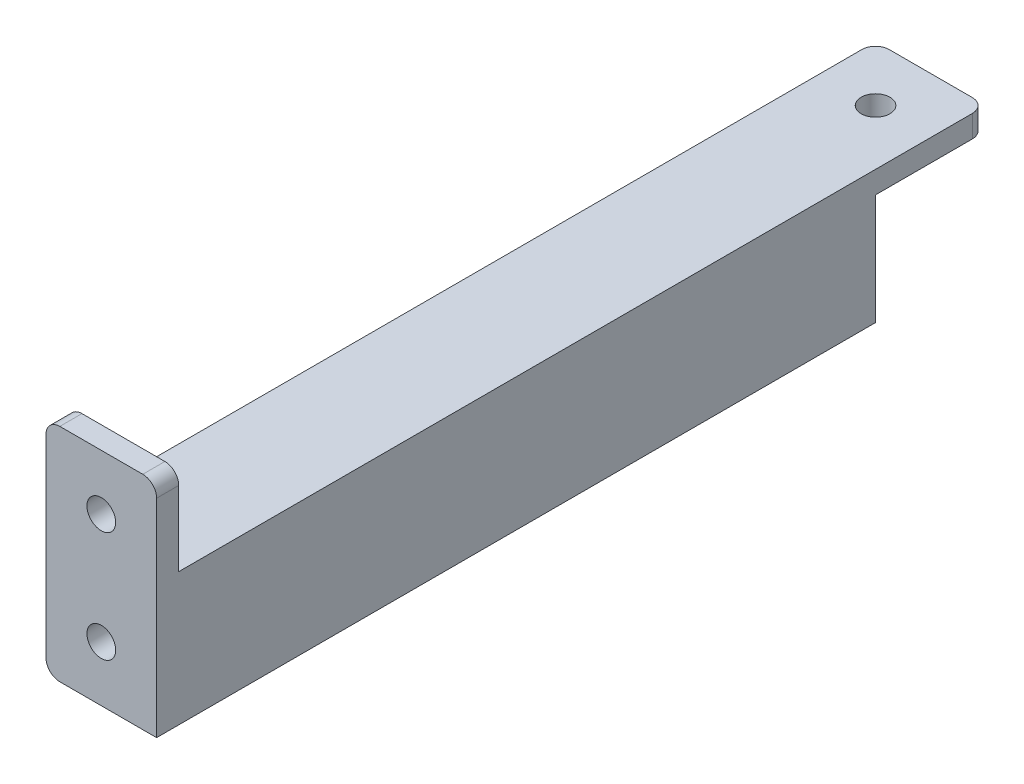
ISO-10303-21;
HEADER;
FILE_DESCRIPTION(('STEP AP214'),'2;1');
FILE_NAME('part.step','',(''),(''),'','','');
FILE_SCHEMA(('AUTOMOTIVE_DESIGN { 1 0 10303 214 1 1 1 1 }'));
ENDSEC;
DATA;
#1=APPLICATION_CONTEXT('core data for automotive mechanical design processes');
#2=APPLICATION_PROTOCOL_DEFINITION('international standard','automotive_design',2000,#1);
#3=PRODUCT_CONTEXT('',#1,'mechanical');
#4=PRODUCT('Part','Part','',(#3));
#5=PRODUCT_RELATED_PRODUCT_CATEGORY('part','',(#4));
#6=PRODUCT_DEFINITION_FORMATION('','',#4);
#7=PRODUCT_DEFINITION_CONTEXT('part definition',#1,'design');
#8=PRODUCT_DEFINITION('design','',#6,#7);
#9=PRODUCT_DEFINITION_SHAPE('','',#8);
#10=(LENGTH_UNIT() NAMED_UNIT(*) SI_UNIT(.MILLI.,.METRE.));
#11=(NAMED_UNIT(*) PLANE_ANGLE_UNIT() SI_UNIT($,.RADIAN.));
#12=(NAMED_UNIT(*) SI_UNIT($,.STERADIAN.) SOLID_ANGLE_UNIT());
#13=UNCERTAINTY_MEASURE_WITH_UNIT(LENGTH_MEASURE(1.E-05),#10,'distance_accuracy_value','');
#14=(GEOMETRIC_REPRESENTATION_CONTEXT(3) GLOBAL_UNCERTAINTY_ASSIGNED_CONTEXT((#13)) GLOBAL_UNIT_ASSIGNED_CONTEXT((#10,
#11,#12)) REPRESENTATION_CONTEXT('',''));
#15=CARTESIAN_POINT('',(0.,0.,0.));
#16=DIRECTION('',(0.,0.,1.));
#17=DIRECTION('',(1.,0.,0.));
#18=AXIS2_PLACEMENT_3D('',#15,#16,#17);
#19=CARTESIAN_POINT('',(0.,20.,-20.));
#20=DIRECTION('',(0.,-1.,0.));
#21=DIRECTION('',(1.,0.,0.));
#22=AXIS2_PLACEMENT_3D('',#19,#20,#21);
#23=PLANE('',#22);
#24=DIRECTION('',(0.,0.,-1.));
#25=VECTOR('',#24,1.);
#26=CARTESIAN_POINT('',(16.,20.,-20.));
#27=LINE('',#26,#25);
#28=CARTESIAN_POINT('',(16.,20.,126.));
#29=VERTEX_POINT('',#28);
#30=CARTESIAN_POINT('',(16.,20.,4.));
#31=VERTEX_POINT('',#30);
#32=EDGE_CURVE('E210',#29,#31,#27,.T.);
#33=ORIENTED_EDGE('',*,*,#32,.F.);
#34=DIRECTION('',(-1.,0.,0.));
#35=VECTOR('',#34,1.);
#36=CARTESIAN_POINT('',(0.,20.,126.));
#37=LINE('',#36,#35);
#38=CARTESIAN_POINT('',(0.,20.,126.));
#39=VERTEX_POINT('',#38);
#40=EDGE_CURVE('E196',#29,#39,#37,.T.);
#41=ORIENTED_EDGE('',*,*,#40,.T.);
#42=DIRECTION('',(0.,0.,1.));
#43=VECTOR('',#42,1.);
#44=CARTESIAN_POINT('',(0.,20.,-20.));
#45=LINE('',#44,#43);
#46=CARTESIAN_POINT('',(0.,20.,4.));
#47=VERTEX_POINT('',#46);
#48=EDGE_CURVE('E232',#47,#39,#45,.T.);
#49=ORIENTED_EDGE('',*,*,#48,.F.);
#50=DIRECTION('',(-1.,0.,0.));
#51=VECTOR('',#50,1.);
#52=CARTESIAN_POINT('',(0.,20.,4.));
#53=LINE('',#52,#51);
#54=EDGE_CURVE('E249',#31,#47,#53,.T.);
#55=ORIENTED_EDGE('',*,*,#54,.F.);
#56=EDGE_LOOP('',(#33,#41,#49,#55));
#57=FACE_BOUND('',#56,.T.);
#58=ADVANCED_FACE('F38',(#57),#23,.T.);
#59=CARTESIAN_POINT('',(20.,24.,-20.));
#60=DIRECTION('',(0.,1.,0.));
#61=DIRECTION('',(-1.,0.,0.));
#62=AXIS2_PLACEMENT_3D('',#59,#60,#61);
#63=PLANE('',#62);
#64=CARTESIAN_POINT('',(10.,24.,-10.));
#65=DIRECTION('',(0.,1.,0.));
#66=DIRECTION('',(0.,0.,1.));
#67=AXIS2_PLACEMENT_3D('',#64,#65,#66);
#68=CIRCLE('',#67,2.59999999999999);
#69=CARTESIAN_POINT('',(10.,24.,-7.40000000000001));
#70=VERTEX_POINT('',#69);
#71=EDGE_CURVE('E393',#70,#70,#68,.T.);
#72=ORIENTED_EDGE('',*,*,#71,.F.);
#73=EDGE_LOOP('',(#72));
#74=FACE_BOUND('',#73,.T.);
#75=DIRECTION('',(0.,0.,1.));
#76=VECTOR('',#75,1.);
#77=CARTESIAN_POINT('',(20.,24.,-20.));
#78=LINE('',#77,#76);
#79=CARTESIAN_POINT('',(20.,24.,-17.5));
#80=VERTEX_POINT('',#79);
#81=CARTESIAN_POINT('',(20.,24.,126.));
#82=VERTEX_POINT('',#81);
#83=EDGE_CURVE('E164',#80,#82,#78,.T.);
#84=ORIENTED_EDGE('',*,*,#83,.F.);
#85=CARTESIAN_POINT('',(17.5,24.,-17.5));
#86=DIRECTION('',(0.,1.,0.));
#87=DIRECTION('',(-1.,0.,0.));
#88=AXIS2_PLACEMENT_3D('',#85,#86,#87);
#89=CIRCLE('',#88,2.5);
#90=CARTESIAN_POINT('',(17.5,24.,-20.));
#91=VERTEX_POINT('',#90);
#92=EDGE_CURVE('E331',#80,#91,#89,.T.);
#93=ORIENTED_EDGE('',*,*,#92,.T.);
#94=DIRECTION('',(-1.,0.,0.));
#95=VECTOR('',#94,1.);
#96=CARTESIAN_POINT('',(20.,24.,-20.));
#97=LINE('',#96,#95);
#98=CARTESIAN_POINT('',(2.5,24.,-20.));
#99=VERTEX_POINT('',#98);
#100=EDGE_CURVE('E228',#91,#99,#97,.T.);
#101=ORIENTED_EDGE('',*,*,#100,.T.);
#102=CARTESIAN_POINT('',(2.5,24.,-17.5));
#103=DIRECTION('',(0.,1.,0.));
#104=DIRECTION('',(-1.,0.,0.));
#105=AXIS2_PLACEMENT_3D('',#102,#103,#104);
#106=CIRCLE('',#105,2.5);
#107=CARTESIAN_POINT('',(0.,24.,-17.5));
#108=VERTEX_POINT('',#107);
#109=EDGE_CURVE('E328',#99,#108,#106,.T.);
#110=ORIENTED_EDGE('',*,*,#109,.T.);
#111=DIRECTION('',(0.,0.,1.));
#112=VECTOR('',#111,1.);
#113=CARTESIAN_POINT('',(0.,24.,-20.));
#114=LINE('',#113,#112);
#115=CARTESIAN_POINT('',(0.,24.,126.));
#116=VERTEX_POINT('',#115);
#117=EDGE_CURVE('E176',#108,#116,#114,.T.);
#118=ORIENTED_EDGE('',*,*,#117,.T.);
#119=DIRECTION('',(1.,0.,0.));
#120=VECTOR('',#119,1.);
#121=CARTESIAN_POINT('',(20.,24.,126.));
#122=LINE('',#121,#120);
#123=EDGE_CURVE('E184',#116,#82,#122,.T.);
#124=ORIENTED_EDGE('',*,*,#123,.T.);
#125=EDGE_LOOP('',(#84,#93,#101,#110,#118,#124));
#126=FACE_BOUND('',#125,.T.);
#127=ADVANCED_FACE('F191',(#74,#126),#63,.T.);
#128=CARTESIAN_POINT('',(16.,0.,154.331050121193));
#129=DIRECTION('',(-1.,0.,0.));
#130=DIRECTION('',(0.,0.,1.));
#131=AXIS2_PLACEMENT_3D('',#128,#129,#130);
#132=PLANE('',#131);
#133=DIRECTION('',(0.,0.,-1.));
#134=VECTOR('',#133,1.);
#135=CARTESIAN_POINT('',(16.,0.,154.331050121193));
#136=LINE('',#135,#134);
#137=CARTESIAN_POINT('',(16.,0.,126.));
#138=VERTEX_POINT('',#137);
#139=CARTESIAN_POINT('',(16.,0.,4.));
#140=VERTEX_POINT('',#139);
#141=EDGE_CURVE('E201',#138,#140,#136,.T.);
#142=ORIENTED_EDGE('',*,*,#141,.F.);
#143=DIRECTION('',(0.,1.,0.));
#144=VECTOR('',#143,1.);
#145=CARTESIAN_POINT('',(16.,0.,126.));
#146=LINE('',#145,#144);
#147=EDGE_CURVE('E269',#138,#29,#146,.T.);
#148=ORIENTED_EDGE('',*,*,#147,.T.);
#149=ORIENTED_EDGE('',*,*,#32,.T.);
#150=DIRECTION('',(0.,1.,0.));
#151=VECTOR('',#150,1.);
#152=CARTESIAN_POINT('',(16.,0.,4.));
#153=LINE('',#152,#151);
#154=EDGE_CURVE('E213',#140,#31,#153,.T.);
#155=ORIENTED_EDGE('',*,*,#154,.F.);
#156=EDGE_LOOP('',(#142,#148,#149,#155));
#157=FACE_BOUND('',#156,.T.);
#158=ADVANCED_FACE('F458',(#157),#132,.T.);
#159=CARTESIAN_POINT('',(0.,0.,4.));
#160=DIRECTION('',(1.,0.,0.));
#161=DIRECTION('',(0.,0.,-1.));
#162=AXIS2_PLACEMENT_3D('',#159,#160,#161);
#163=PLANE('',#162);
#164=DIRECTION('',(0.,-1.,0.));
#165=VECTOR('',#164,1.);
#166=CARTESIAN_POINT('',(0.,0.,0.));
#167=LINE('',#166,#165);
#168=CARTESIAN_POINT('',(0.,20.,0.));
#169=VERTEX_POINT('',#168);
#170=CARTESIAN_POINT('',(0.,2.5,0.));
#171=VERTEX_POINT('',#170);
#172=EDGE_CURVE('E234',#169,#171,#167,.T.);
#173=ORIENTED_EDGE('',*,*,#172,.T.);
#174=DIRECTION('',(0.,0.,-1.));
#175=VECTOR('',#174,1.);
#176=CARTESIAN_POINT('',(0.,2.5,4.));
#177=LINE('',#176,#175);
#178=CARTESIAN_POINT('',(0.,2.5,4.));
#179=VERTEX_POINT('',#178);
#180=EDGE_CURVE('E293',#171,#179,#177,.F.);
#181=ORIENTED_EDGE('',*,*,#180,.T.);
#182=DIRECTION('',(0.,-1.,0.));
#183=VECTOR('',#182,1.);
#184=CARTESIAN_POINT('',(0.,0.,4.));
#185=LINE('',#184,#183);
#186=EDGE_CURVE('E241',#47,#179,#185,.T.);
#187=ORIENTED_EDGE('',*,*,#186,.F.);
#188=ORIENTED_EDGE('',*,*,#48,.T.);
#189=DIRECTION('',(0.,-1.,0.));
#190=VECTOR('',#189,1.);
#191=CARTESIAN_POINT('',(0.,0.,126.));
#192=LINE('',#191,#190);
#193=CARTESIAN_POINT('',(0.,2.5,126.));
#194=VERTEX_POINT('',#193);
#195=EDGE_CURVE('E347',#39,#194,#192,.T.);
#196=ORIENTED_EDGE('',*,*,#195,.T.);
#197=DIRECTION('',(0.,0.,1.));
#198=VECTOR('',#197,1.);
#199=CARTESIAN_POINT('',(0.,2.5,4.));
#200=LINE('',#199,#198);
#201=CARTESIAN_POINT('',(0.,2.5,130.));
#202=VERTEX_POINT('',#201);
#203=EDGE_CURVE('E289',#194,#202,#200,.T.);
#204=ORIENTED_EDGE('',*,*,#203,.T.);
#205=DIRECTION('',(0.,-1.,0.));
#206=VECTOR('',#205,1.);
#207=CARTESIAN_POINT('',(0.,24.,130.));
#208=LINE('',#207,#206);
#209=CARTESIAN_POINT('',(0.,37.5,130.));
#210=VERTEX_POINT('',#209);
#211=EDGE_CURVE('E217',#210,#202,#208,.T.);
#212=ORIENTED_EDGE('',*,*,#211,.F.);
#213=DIRECTION('',(0.,0.,1.));
#214=VECTOR('',#213,1.);
#215=CARTESIAN_POINT('',(0.,37.5,126.));
#216=LINE('',#215,#214);
#217=CARTESIAN_POINT('',(0.,37.5,126.));
#218=VERTEX_POINT('',#217);
#219=EDGE_CURVE('E286',#210,#218,#216,.F.);
#220=ORIENTED_EDGE('',*,*,#219,.T.);
#221=EDGE_CURVE('E358',#218,#116,#192,.T.);
#222=ORIENTED_EDGE('',*,*,#221,.T.);
#223=ORIENTED_EDGE('',*,*,#117,.F.);
#224=DIRECTION('',(0.,-1.,0.));
#225=VECTOR('',#224,1.);
#226=CARTESIAN_POINT('',(0.,0.,-17.5));
#227=LINE('',#226,#225);
#228=CARTESIAN_POINT('',(0.,20.,-17.5));
#229=VERTEX_POINT('',#228);
#230=EDGE_CURVE('E282',#108,#229,#227,.T.);
#231=ORIENTED_EDGE('',*,*,#230,.T.);
#232=EDGE_CURVE('E238',#229,#169,#45,.T.);
#233=ORIENTED_EDGE('',*,*,#232,.T.);
#234=EDGE_LOOP('',(#173,#181,#187,#188,#196,#204,#212,#220,#222,#223,#231,#233));
#235=FACE_BOUND('',#234,.T.);
#236=ADVANCED_FACE('F346',(#235),#163,.F.);
#237=CARTESIAN_POINT('',(0.,0.,4.));
#238=DIRECTION('',(0.,1.,0.));
#239=DIRECTION('',(0.,0.,1.));
#240=AXIS2_PLACEMENT_3D('',#237,#238,#239);
#241=PLANE('',#240);
#242=DIRECTION('',(1.,0.,0.));
#243=VECTOR('',#242,1.);
#244=CARTESIAN_POINT('',(0.,0.,4.));
#245=LINE('',#244,#243);
#246=CARTESIAN_POINT('',(2.5,0.,4.));
#247=VERTEX_POINT('',#246);
#248=EDGE_CURVE('E245',#247,#140,#245,.T.);
#249=ORIENTED_EDGE('',*,*,#248,.F.);
#250=DIRECTION('',(0.,0.,-1.));
#251=VECTOR('',#250,1.);
#252=CARTESIAN_POINT('',(2.5,0.,4.));
#253=LINE('',#252,#251);
#254=CARTESIAN_POINT('',(2.5,0.,0.));
#255=VERTEX_POINT('',#254);
#256=EDGE_CURVE('E275',#247,#255,#253,.T.);
#257=ORIENTED_EDGE('',*,*,#256,.T.);
#258=DIRECTION('',(1.,0.,0.));
#259=VECTOR('',#258,1.);
#260=CARTESIAN_POINT('',(0.,0.,0.));
#261=LINE('',#260,#259);
#262=CARTESIAN_POINT('',(20.,0.,0.));
#263=VERTEX_POINT('',#262);
#264=EDGE_CURVE('E256',#255,#263,#261,.T.);
#265=ORIENTED_EDGE('',*,*,#264,.T.);
#266=DIRECTION('',(0.,0.,-1.));
#267=VECTOR('',#266,1.);
#268=CARTESIAN_POINT('',(20.,0.,4.));
#269=LINE('',#268,#267);
#270=CARTESIAN_POINT('',(20.,0.,130.));
#271=VERTEX_POINT('',#270);
#272=EDGE_CURVE('E252',#271,#263,#269,.T.);
#273=ORIENTED_EDGE('',*,*,#272,.F.);
#274=DIRECTION('',(-1.,0.,0.));
#275=VECTOR('',#274,1.);
#276=CARTESIAN_POINT('',(20.,0.,130.));
#277=LINE('',#276,#275);
#278=CARTESIAN_POINT('',(2.5,0.,130.));
#279=VERTEX_POINT('',#278);
#280=EDGE_CURVE('E195',#271,#279,#277,.T.);
#281=ORIENTED_EDGE('',*,*,#280,.T.);
#282=DIRECTION('',(0.,0.,1.));
#283=VECTOR('',#282,1.);
#284=CARTESIAN_POINT('',(2.5,0.,4.));
#285=LINE('',#284,#283);
#286=CARTESIAN_POINT('',(2.5,0.,126.));
#287=VERTEX_POINT('',#286);
#288=EDGE_CURVE('E272',#279,#287,#285,.F.);
#289=ORIENTED_EDGE('',*,*,#288,.T.);
#290=DIRECTION('',(1.,0.,0.));
#291=VECTOR('',#290,1.);
#292=CARTESIAN_POINT('',(20.,0.,126.));
#293=LINE('',#292,#291);
#294=EDGE_CURVE('E203',#287,#138,#293,.T.);
#295=ORIENTED_EDGE('',*,*,#294,.T.);
#296=ORIENTED_EDGE('',*,*,#141,.T.);
#297=EDGE_LOOP('',(#249,#257,#265,#273,#281,#289,#295,#296));
#298=FACE_BOUND('',#297,.T.);
#299=ADVANCED_FACE('F421',(#298),#241,.F.);
#300=CARTESIAN_POINT('',(20.,0.,4.));
#301=DIRECTION('',(-1.,0.,0.));
#302=DIRECTION('',(0.,0.,1.));
#303=AXIS2_PLACEMENT_3D('',#300,#301,#302);
#304=PLANE('',#303);
#305=DIRECTION('',(0.,1.,0.));
#306=VECTOR('',#305,1.);
#307=CARTESIAN_POINT('',(20.,0.,126.));
#308=LINE('',#307,#306);
#309=CARTESIAN_POINT('',(20.,37.5,126.));
#310=VERTEX_POINT('',#309);
#311=EDGE_CURVE('E168',#82,#310,#308,.T.);
#312=ORIENTED_EDGE('',*,*,#311,.T.);
#313=DIRECTION('',(0.,0.,1.));
#314=VECTOR('',#313,1.);
#315=CARTESIAN_POINT('',(20.,37.5,130.));
#316=LINE('',#315,#314);
#317=CARTESIAN_POINT('',(20.,37.5,130.));
#318=VERTEX_POINT('',#317);
#319=EDGE_CURVE('E313',#310,#318,#316,.T.);
#320=ORIENTED_EDGE('',*,*,#319,.T.);
#321=DIRECTION('',(0.,1.,0.));
#322=VECTOR('',#321,1.);
#323=CARTESIAN_POINT('',(20.,20.,130.));
#324=LINE('',#323,#322);
#325=EDGE_CURVE('E221',#271,#318,#324,.T.);
#326=ORIENTED_EDGE('',*,*,#325,.F.);
#327=ORIENTED_EDGE('',*,*,#272,.T.);
#328=DIRECTION('',(0.,1.,0.));
#329=VECTOR('',#328,1.);
#330=CARTESIAN_POINT('',(20.,0.,0.));
#331=LINE('',#330,#329);
#332=CARTESIAN_POINT('',(20.,20.,0.));
#333=VERTEX_POINT('',#332);
#334=EDGE_CURVE('E259',#263,#333,#331,.T.);
#335=ORIENTED_EDGE('',*,*,#334,.T.);
#336=DIRECTION('',(0.,0.,1.));
#337=VECTOR('',#336,1.);
#338=CARTESIAN_POINT('',(20.,20.,-20.));
#339=LINE('',#338,#337);
#340=CARTESIAN_POINT('',(20.,20.,-17.5));
#341=VERTEX_POINT('',#340);
#342=EDGE_CURVE('E177',#341,#333,#339,.T.);
#343=ORIENTED_EDGE('',*,*,#342,.F.);
#344=DIRECTION('',(0.,1.,0.));
#345=VECTOR('',#344,1.);
#346=CARTESIAN_POINT('',(20.,0.,-17.5));
#347=LINE('',#346,#345);
#348=EDGE_CURVE('E172',#341,#80,#347,.T.);
#349=ORIENTED_EDGE('',*,*,#348,.T.);
#350=ORIENTED_EDGE('',*,*,#83,.T.);
#351=EDGE_LOOP('',(#312,#320,#326,#327,#335,#343,#349,#350));
#352=FACE_BOUND('',#351,.T.);
#353=ADVANCED_FACE('F166',(#352),#304,.F.);
#354=CARTESIAN_POINT('',(0.,0.,4.));
#355=DIRECTION('',(0.,0.,-1.));
#356=DIRECTION('',(-1.,0.,0.));
#357=AXIS2_PLACEMENT_3D('',#354,#355,#356);
#358=PLANE('',#357);
#359=CARTESIAN_POINT('',(10.,10.,4.));
#360=DIRECTION('',(0.,0.,1.));
#361=DIRECTION('',(1.,0.,0.));
#362=AXIS2_PLACEMENT_3D('',#359,#360,#361);
#363=CIRCLE('',#362,2.59999999999999);
#364=CARTESIAN_POINT('',(12.6,10.,4.));
#365=VERTEX_POINT('',#364);
#366=EDGE_CURVE('E401',#365,#365,#363,.T.);
#367=ORIENTED_EDGE('',*,*,#366,.F.);
#368=EDGE_LOOP('',(#367));
#369=FACE_BOUND('',#368,.T.);
#370=ORIENTED_EDGE('',*,*,#186,.T.);
#371=CARTESIAN_POINT('',(2.5,2.5,4.));
#372=DIRECTION('',(0.,0.,-1.));
#373=DIRECTION('',(-1.,0.,0.));
#374=AXIS2_PLACEMENT_3D('',#371,#372,#373);
#375=CIRCLE('',#374,2.5);
#376=EDGE_CURVE('E296',#179,#247,#375,.F.);
#377=ORIENTED_EDGE('',*,*,#376,.T.);
#378=ORIENTED_EDGE('',*,*,#248,.T.);
#379=ORIENTED_EDGE('',*,*,#154,.T.);
#380=ORIENTED_EDGE('',*,*,#54,.T.);
#381=EDGE_LOOP('',(#370,#377,#378,#379,#380));
#382=FACE_BOUND('',#381,.T.);
#383=ADVANCED_FACE('F408',(#369,#382),#358,.F.);
#384=CARTESIAN_POINT('',(0.,0.,0.));
#385=DIRECTION('',(0.,0.,-1.));
#386=DIRECTION('',(-1.,0.,0.));
#387=AXIS2_PLACEMENT_3D('',#384,#385,#386);
#388=PLANE('',#387);
#389=CARTESIAN_POINT('',(10.,10.,0.));
#390=DIRECTION('',(0.,0.,-1.));
#391=DIRECTION('',(-1.,0.,0.));
#392=AXIS2_PLACEMENT_3D('',#389,#390,#391);
#393=CIRCLE('',#392,2.59999999999999);
#394=CARTESIAN_POINT('',(7.40000000000001,10.,0.));
#395=VERTEX_POINT('',#394);
#396=EDGE_CURVE('E397',#395,#395,#393,.T.);
#397=ORIENTED_EDGE('',*,*,#396,.F.);
#398=EDGE_LOOP('',(#397));
#399=FACE_BOUND('',#398,.T.);
#400=ORIENTED_EDGE('',*,*,#264,.F.);
#401=CARTESIAN_POINT('',(2.5,2.5,0.));
#402=DIRECTION('',(0.,0.,-1.));
#403=DIRECTION('',(-1.,0.,0.));
#404=AXIS2_PLACEMENT_3D('',#401,#402,#403);
#405=CIRCLE('',#404,2.5);
#406=EDGE_CURVE('E279',#255,#171,#405,.T.);
#407=ORIENTED_EDGE('',*,*,#406,.T.);
#408=ORIENTED_EDGE('',*,*,#172,.F.);
#409=DIRECTION('',(-1.,0.,0.));
#410=VECTOR('',#409,1.);
#411=CARTESIAN_POINT('',(0.,20.,0.));
#412=LINE('',#411,#410);
#413=EDGE_CURVE('E246',#333,#169,#412,.T.);
#414=ORIENTED_EDGE('',*,*,#413,.F.);
#415=ORIENTED_EDGE('',*,*,#334,.F.);
#416=EDGE_LOOP('',(#400,#407,#408,#414,#415));
#417=FACE_BOUND('',#416,.T.);
#418=ADVANCED_FACE('F411',(#399,#417),#388,.T.);
#419=CARTESIAN_POINT('',(10.,20.,-10.));
#420=DIRECTION('',(0.,-1.,0.));
#421=DIRECTION('',(1.,0.,0.));
#422=AXIS2_PLACEMENT_3D('',#419,#420,#421);
#423=CIRCLE('',#422,2.59999999999999);
#424=CARTESIAN_POINT('',(12.6,20.,-10.));
#425=VERTEX_POINT('',#424);
#426=EDGE_CURVE('E389',#425,#425,#423,.T.);
#427=ORIENTED_EDGE('',*,*,#426,.F.);
#428=EDGE_LOOP('',(#427));
#429=FACE_BOUND('',#428,.T.);
#430=DIRECTION('',(1.,0.,0.));
#431=VECTOR('',#430,1.);
#432=CARTESIAN_POINT('',(0.,20.,-20.));
#433=LINE('',#432,#431);
#434=CARTESIAN_POINT('',(2.5,20.,-20.));
#435=VERTEX_POINT('',#434);
#436=CARTESIAN_POINT('',(17.5,20.,-20.));
#437=VERTEX_POINT('',#436);
#438=EDGE_CURVE('E225',#435,#437,#433,.T.);
#439=ORIENTED_EDGE('',*,*,#438,.T.);
#440=CARTESIAN_POINT('',(17.5,20.,-17.5));
#441=DIRECTION('',(0.,-1.,0.));
#442=DIRECTION('',(1.,0.,0.));
#443=AXIS2_PLACEMENT_3D('',#440,#441,#442);
#444=CIRCLE('',#443,2.5);
#445=EDGE_CURVE('E11',#437,#341,#444,.T.);
#446=ORIENTED_EDGE('',*,*,#445,.T.);
#447=ORIENTED_EDGE('',*,*,#342,.T.);
#448=ORIENTED_EDGE('',*,*,#413,.T.);
#449=ORIENTED_EDGE('',*,*,#232,.F.);
#450=CARTESIAN_POINT('',(2.5,20.,-17.5));
#451=DIRECTION('',(0.,-1.,0.));
#452=DIRECTION('',(1.,0.,0.));
#453=AXIS2_PLACEMENT_3D('',#450,#451,#452);
#454=CIRCLE('',#453,2.5);
#455=EDGE_CURVE('E47',#229,#435,#454,.T.);
#456=ORIENTED_EDGE('',*,*,#455,.T.);
#457=EDGE_LOOP('',(#439,#446,#447,#448,#449,#456));
#458=FACE_BOUND('',#457,.T.);
#459=ADVANCED_FACE('F454',(#429,#458),#23,.T.);
#460=CARTESIAN_POINT('',(0.,0.,-20.));
#461=DIRECTION('',(0.,0.,1.));
#462=DIRECTION('',(1.,0.,0.));
#463=AXIS2_PLACEMENT_3D('',#460,#461,#462);
#464=PLANE('',#463);
#465=ORIENTED_EDGE('',*,*,#100,.F.);
#466=DIRECTION('',(0.,1.,0.));
#467=VECTOR('',#466,1.);
#468=CARTESIAN_POINT('',(17.5,0.,-20.));
#469=LINE('',#468,#467);
#470=EDGE_CURVE('E54',#91,#437,#469,.F.);
#471=ORIENTED_EDGE('',*,*,#470,.T.);
#472=ORIENTED_EDGE('',*,*,#438,.F.);
#473=DIRECTION('',(0.,-1.,0.));
#474=VECTOR('',#473,1.);
#475=CARTESIAN_POINT('',(2.5,0.,-20.));
#476=LINE('',#475,#474);
#477=EDGE_CURVE('E334',#435,#99,#476,.F.);
#478=ORIENTED_EDGE('',*,*,#477,.T.);
#479=EDGE_LOOP('',(#465,#471,#472,#478));
#480=FACE_BOUND('',#479,.T.);
#481=ADVANCED_FACE('F463',(#480),#464,.F.);
#482=CARTESIAN_POINT('',(0.,0.,130.));
#483=DIRECTION('',(0.,0.,1.));
#484=DIRECTION('',(1.,0.,0.));
#485=AXIS2_PLACEMENT_3D('',#482,#483,#484);
#486=PLANE('',#485);
#487=CARTESIAN_POINT('',(10.,30.,130.));
#488=DIRECTION('',(0.,0.,-1.));
#489=DIRECTION('',(-1.,0.,0.));
#490=AXIS2_PLACEMENT_3D('',#487,#488,#489);
#491=CIRCLE('',#490,2.6);
#492=CARTESIAN_POINT('',(7.4,30.,130.));
#493=VERTEX_POINT('',#492);
#494=EDGE_CURVE('E379',#493,#493,#491,.T.);
#495=ORIENTED_EDGE('',*,*,#494,.T.);
#496=EDGE_LOOP('',(#495));
#497=FACE_BOUND('',#496,.T.);
#498=CARTESIAN_POINT('',(10.,10.,130.));
#499=DIRECTION('',(0.,0.,-1.));
#500=DIRECTION('',(-1.,0.,0.));
#501=AXIS2_PLACEMENT_3D('',#498,#499,#500);
#502=CIRCLE('',#501,2.6);
#503=CARTESIAN_POINT('',(7.4,10.,130.));
#504=VERTEX_POINT('',#503);
#505=EDGE_CURVE('E368',#504,#504,#502,.T.);
#506=ORIENTED_EDGE('',*,*,#505,.T.);
#507=EDGE_LOOP('',(#506));
#508=FACE_BOUND('',#507,.T.);
#509=ORIENTED_EDGE('',*,*,#211,.T.);
#510=CARTESIAN_POINT('',(2.5,2.5,130.));
#511=DIRECTION('',(0.,0.,1.));
#512=DIRECTION('',(1.,0.,0.));
#513=AXIS2_PLACEMENT_3D('',#510,#511,#512);
#514=CIRCLE('',#513,2.5);
#515=EDGE_CURVE('E305',#202,#279,#514,.T.);
#516=ORIENTED_EDGE('',*,*,#515,.T.);
#517=ORIENTED_EDGE('',*,*,#280,.F.);
#518=ORIENTED_EDGE('',*,*,#325,.T.);
#519=CARTESIAN_POINT('',(17.5,37.5,130.));
#520=DIRECTION('',(0.,0.,1.));
#521=DIRECTION('',(1.,0.,0.));
#522=AXIS2_PLACEMENT_3D('',#519,#520,#521);
#523=CIRCLE('',#522,2.5);
#524=CARTESIAN_POINT('',(17.5,40.,130.));
#525=VERTEX_POINT('',#524);
#526=EDGE_CURVE('E302',#318,#525,#523,.T.);
#527=ORIENTED_EDGE('',*,*,#526,.T.);
#528=DIRECTION('',(-1.,0.,0.));
#529=VECTOR('',#528,1.);
#530=CARTESIAN_POINT('',(20.,40.,130.));
#531=LINE('',#530,#529);
#532=CARTESIAN_POINT('',(2.5,40.,130.));
#533=VERTEX_POINT('',#532);
#534=EDGE_CURVE('E189',#525,#533,#531,.T.);
#535=ORIENTED_EDGE('',*,*,#534,.T.);
#536=CARTESIAN_POINT('',(2.5,37.5,130.));
#537=DIRECTION('',(0.,0.,1.));
#538=DIRECTION('',(1.,0.,0.));
#539=AXIS2_PLACEMENT_3D('',#536,#537,#538);
#540=CIRCLE('',#539,2.5);
#541=EDGE_CURVE('E299',#533,#210,#540,.T.);
#542=ORIENTED_EDGE('',*,*,#541,.T.);
#543=EDGE_LOOP('',(#509,#516,#517,#518,#527,#535,#542));
#544=FACE_BOUND('',#543,.T.);
#545=ADVANCED_FACE('F433',(#497,#508,#544),#486,.T.);
#546=CARTESIAN_POINT('',(0.,0.,126.));
#547=DIRECTION('',(0.,0.,1.));
#548=DIRECTION('',(1.,0.,0.));
#549=AXIS2_PLACEMENT_3D('',#546,#547,#548);
#550=PLANE('',#549);
#551=CARTESIAN_POINT('',(10.,10.,126.));
#552=DIRECTION('',(0.,0.,-1.));
#553=DIRECTION('',(-1.,0.,0.));
#554=AXIS2_PLACEMENT_3D('',#551,#552,#553);
#555=CIRCLE('',#554,2.59999999999999);
#556=CARTESIAN_POINT('',(7.40000000000001,10.,126.));
#557=VERTEX_POINT('',#556);
#558=EDGE_CURVE('E373',#557,#557,#555,.T.);
#559=ORIENTED_EDGE('',*,*,#558,.F.);
#560=EDGE_LOOP('',(#559));
#561=FACE_BOUND('',#560,.T.);
#562=ORIENTED_EDGE('',*,*,#294,.F.);
#563=CARTESIAN_POINT('',(2.5,2.5,126.));
#564=DIRECTION('',(0.,0.,1.));
#565=DIRECTION('',(1.,0.,0.));
#566=AXIS2_PLACEMENT_3D('',#563,#564,#565);
#567=CIRCLE('',#566,2.5);
#568=EDGE_CURVE('E308',#287,#194,#567,.F.);
#569=ORIENTED_EDGE('',*,*,#568,.T.);
#570=ORIENTED_EDGE('',*,*,#195,.F.);
#571=ORIENTED_EDGE('',*,*,#40,.F.);
#572=ORIENTED_EDGE('',*,*,#147,.F.);
#573=EDGE_LOOP('',(#562,#569,#570,#571,#572));
#574=FACE_BOUND('',#573,.T.);
#575=ADVANCED_FACE('F354',(#561,#574),#550,.F.);
#576=CARTESIAN_POINT('',(10.,30.,126.));
#577=DIRECTION('',(0.,0.,-1.));
#578=DIRECTION('',(-1.,0.,0.));
#579=AXIS2_PLACEMENT_3D('',#576,#577,#578);
#580=CIRCLE('',#579,2.59999999999999);
#581=CARTESIAN_POINT('',(7.40000000000001,30.,126.));
#582=VERTEX_POINT('',#581);
#583=EDGE_CURVE('E385',#582,#582,#580,.T.);
#584=ORIENTED_EDGE('',*,*,#583,.F.);
#585=EDGE_LOOP('',(#584));
#586=FACE_BOUND('',#585,.T.);
#587=DIRECTION('',(-1.,0.,0.));
#588=VECTOR('',#587,1.);
#589=CARTESIAN_POINT('',(20.,40.,126.));
#590=LINE('',#589,#588);
#591=CARTESIAN_POINT('',(17.5,40.,126.));
#592=VERTEX_POINT('',#591);
#593=CARTESIAN_POINT('',(2.5,40.,126.));
#594=VERTEX_POINT('',#593);
#595=EDGE_CURVE('E188',#592,#594,#590,.T.);
#596=ORIENTED_EDGE('',*,*,#595,.F.);
#597=CARTESIAN_POINT('',(17.5,37.5,126.));
#598=DIRECTION('',(0.,0.,1.));
#599=DIRECTION('',(1.,0.,0.));
#600=AXIS2_PLACEMENT_3D('',#597,#598,#599);
#601=CIRCLE('',#600,2.5);
#602=EDGE_CURVE('E186',#592,#310,#601,.F.);
#603=ORIENTED_EDGE('',*,*,#602,.T.);
#604=ORIENTED_EDGE('',*,*,#311,.F.);
#605=ORIENTED_EDGE('',*,*,#123,.F.);
#606=ORIENTED_EDGE('',*,*,#221,.F.);
#607=CARTESIAN_POINT('',(2.5,37.5,126.));
#608=DIRECTION('',(0.,0.,1.));
#609=DIRECTION('',(1.,0.,0.));
#610=AXIS2_PLACEMENT_3D('',#607,#608,#609);
#611=CIRCLE('',#610,2.5);
#612=EDGE_CURVE('E323',#218,#594,#611,.F.);
#613=ORIENTED_EDGE('',*,*,#612,.T.);
#614=EDGE_LOOP('',(#596,#603,#604,#605,#606,#613));
#615=FACE_BOUND('',#614,.T.);
#616=ADVANCED_FACE('F182',(#586,#615),#550,.F.);
#617=CARTESIAN_POINT('',(20.,40.,126.));
#618=DIRECTION('',(0.,1.,0.));
#619=DIRECTION('',(-1.,0.,0.));
#620=AXIS2_PLACEMENT_3D('',#617,#618,#619);
#621=PLANE('',#620);
#622=ORIENTED_EDGE('',*,*,#534,.F.);
#623=DIRECTION('',(0.,0.,1.));
#624=VECTOR('',#623,1.);
#625=CARTESIAN_POINT('',(17.5,40.,126.));
#626=LINE('',#625,#624);
#627=EDGE_CURVE('E320',#525,#592,#626,.F.);
#628=ORIENTED_EDGE('',*,*,#627,.T.);
#629=ORIENTED_EDGE('',*,*,#595,.T.);
#630=DIRECTION('',(0.,0.,1.));
#631=VECTOR('',#630,1.);
#632=CARTESIAN_POINT('',(2.5,40.,130.));
#633=LINE('',#632,#631);
#634=EDGE_CURVE('E316',#594,#533,#633,.T.);
#635=ORIENTED_EDGE('',*,*,#634,.T.);
#636=EDGE_LOOP('',(#622,#628,#629,#635));
#637=FACE_BOUND('',#636,.T.);
#638=ADVANCED_FACE('F439',(#637),#621,.T.);
#639=CARTESIAN_POINT('',(10.,10.,126.));
#640=DIRECTION('',(0.,0.,-1.));
#641=DIRECTION('',(-1.,0.,0.));
#642=AXIS2_PLACEMENT_3D('',#639,#640,#641);
#643=CYLINDRICAL_SURFACE('',#642,2.59999999999999);
#644=ORIENTED_EDGE('',*,*,#505,.F.);
#645=EDGE_LOOP('',(#644));
#646=FACE_BOUND('',#645,.T.);
#647=ORIENTED_EDGE('',*,*,#558,.T.);
#648=EDGE_LOOP('',(#647));
#649=FACE_BOUND('',#648,.T.);
#650=ADVANCED_FACE('F518',(#646,#649),#643,.F.);
#651=CARTESIAN_POINT('',(10.,30.,126.));
#652=DIRECTION('',(0.,0.,-1.));
#653=DIRECTION('',(-1.,0.,0.));
#654=AXIS2_PLACEMENT_3D('',#651,#652,#653);
#655=CYLINDRICAL_SURFACE('',#654,2.59999999999999);
#656=ORIENTED_EDGE('',*,*,#494,.F.);
#657=EDGE_LOOP('',(#656));
#658=FACE_BOUND('',#657,.T.);
#659=ORIENTED_EDGE('',*,*,#583,.T.);
#660=EDGE_LOOP('',(#659));
#661=FACE_BOUND('',#660,.T.);
#662=ADVANCED_FACE('F625',(#658,#661),#655,.F.);
#663=CARTESIAN_POINT('',(10.,24.,-10.));
#664=DIRECTION('',(0.,1.,0.));
#665=DIRECTION('',(0.,0.,1.));
#666=AXIS2_PLACEMENT_3D('',#663,#664,#665);
#667=CYLINDRICAL_SURFACE('',#666,2.59999999999999);
#668=ORIENTED_EDGE('',*,*,#426,.T.);
#669=EDGE_LOOP('',(#668));
#670=FACE_BOUND('',#669,.T.);
#671=ORIENTED_EDGE('',*,*,#71,.T.);
#672=EDGE_LOOP('',(#671));
#673=FACE_BOUND('',#672,.T.);
#674=ADVANCED_FACE('F615',(#670,#673),#667,.F.);
#675=CARTESIAN_POINT('',(10.,10.,4.));
#676=DIRECTION('',(0.,0.,1.));
#677=DIRECTION('',(1.,0.,0.));
#678=AXIS2_PLACEMENT_3D('',#675,#676,#677);
#679=CYLINDRICAL_SURFACE('',#678,2.59999999999999);
#680=ORIENTED_EDGE('',*,*,#396,.T.);
#681=EDGE_LOOP('',(#680));
#682=FACE_BOUND('',#681,.T.);
#683=ORIENTED_EDGE('',*,*,#366,.T.);
#684=EDGE_LOOP('',(#683));
#685=FACE_BOUND('',#684,.T.);
#686=ADVANCED_FACE('F406',(#682,#685),#679,.F.);
#687=CARTESIAN_POINT('',(2.5,2.5,4.));
#688=DIRECTION('',(0.,0.,-1.));
#689=DIRECTION('',(-1.,0.,0.));
#690=AXIS2_PLACEMENT_3D('',#687,#688,#689);
#691=CYLINDRICAL_SURFACE('',#690,2.5);
#692=ORIENTED_EDGE('',*,*,#376,.F.);
#693=ORIENTED_EDGE('',*,*,#180,.F.);
#694=ORIENTED_EDGE('',*,*,#406,.F.);
#695=ORIENTED_EDGE('',*,*,#256,.F.);
#696=EDGE_LOOP('',(#692,#693,#694,#695));
#697=FACE_BOUND('',#696,.T.);
#698=ADVANCED_FACE('F418',(#697),#691,.T.);
#699=CARTESIAN_POINT('',(2.5,2.5,4.));
#700=DIRECTION('',(0.,0.,1.));
#701=DIRECTION('',(1.,0.,0.));
#702=AXIS2_PLACEMENT_3D('',#699,#700,#701);
#703=CYLINDRICAL_SURFACE('',#702,2.5);
#704=ORIENTED_EDGE('',*,*,#568,.F.);
#705=ORIENTED_EDGE('',*,*,#288,.F.);
#706=ORIENTED_EDGE('',*,*,#515,.F.);
#707=ORIENTED_EDGE('',*,*,#203,.F.);
#708=EDGE_LOOP('',(#704,#705,#706,#707));
#709=FACE_BOUND('',#708,.T.);
#710=ADVANCED_FACE('F430',(#709),#703,.T.);
#711=CARTESIAN_POINT('',(17.5,37.5,4.));
#712=DIRECTION('',(0.,0.,-1.));
#713=DIRECTION('',(-1.,0.,0.));
#714=AXIS2_PLACEMENT_3D('',#711,#712,#713);
#715=CYLINDRICAL_SURFACE('',#714,2.5);
#716=ORIENTED_EDGE('',*,*,#602,.F.);
#717=ORIENTED_EDGE('',*,*,#627,.F.);
#718=ORIENTED_EDGE('',*,*,#526,.F.);
#719=ORIENTED_EDGE('',*,*,#319,.F.);
#720=EDGE_LOOP('',(#716,#717,#718,#719));
#721=FACE_BOUND('',#720,.T.);
#722=ADVANCED_FACE('F442',(#721),#715,.T.);
#723=CARTESIAN_POINT('',(2.5,37.5,126.));
#724=DIRECTION('',(0.,0.,-1.));
#725=DIRECTION('',(-1.,0.,0.));
#726=AXIS2_PLACEMENT_3D('',#723,#724,#725);
#727=CYLINDRICAL_SURFACE('',#726,2.5);
#728=ORIENTED_EDGE('',*,*,#612,.F.);
#729=ORIENTED_EDGE('',*,*,#219,.F.);
#730=ORIENTED_EDGE('',*,*,#541,.F.);
#731=ORIENTED_EDGE('',*,*,#634,.F.);
#732=EDGE_LOOP('',(#728,#729,#730,#731));
#733=FACE_BOUND('',#732,.T.);
#734=ADVANCED_FACE('F437',(#733),#727,.T.);
#735=CARTESIAN_POINT('',(17.5,0.,-17.5));
#736=DIRECTION('',(0.,1.,0.));
#737=DIRECTION('',(0.,0.,1.));
#738=AXIS2_PLACEMENT_3D('',#735,#736,#737);
#739=CYLINDRICAL_SURFACE('',#738,2.5);
#740=ORIENTED_EDGE('',*,*,#445,.F.);
#741=ORIENTED_EDGE('',*,*,#470,.F.);
#742=ORIENTED_EDGE('',*,*,#92,.F.);
#743=ORIENTED_EDGE('',*,*,#348,.F.);
#744=EDGE_LOOP('',(#740,#741,#742,#743));
#745=FACE_BOUND('',#744,.T.);
#746=ADVANCED_FACE('F449',(#745),#739,.T.);
#747=CARTESIAN_POINT('',(2.5,0.,-17.5));
#748=DIRECTION('',(0.,-1.,0.));
#749=DIRECTION('',(0.,0.,-1.));
#750=AXIS2_PLACEMENT_3D('',#747,#748,#749);
#751=CYLINDRICAL_SURFACE('',#750,2.5);
#752=ORIENTED_EDGE('',*,*,#109,.F.);
#753=ORIENTED_EDGE('',*,*,#477,.F.);
#754=ORIENTED_EDGE('',*,*,#455,.F.);
#755=ORIENTED_EDGE('',*,*,#230,.F.);
#756=EDGE_LOOP('',(#752,#753,#754,#755));
#757=FACE_BOUND('',#756,.T.);
#758=ADVANCED_FACE('F40',(#757),#751,.T.);
#759=CLOSED_SHELL('',(#58,#127,#158,#236,#299,#353,#383,#418,#459,#481,#545,#575,#616,#638,#650,
#662,#674,#686,#698,#710,#722,#734,#746,#758));
#760=MANIFOLD_SOLID_BREP('B2',#759);
#761=ADVANCED_BREP_SHAPE_REPRESENTATION('',(#18,#760),#14);
#762=SHAPE_DEFINITION_REPRESENTATION(#9,#761);
ENDSEC;
END-ISO-10303-21;
